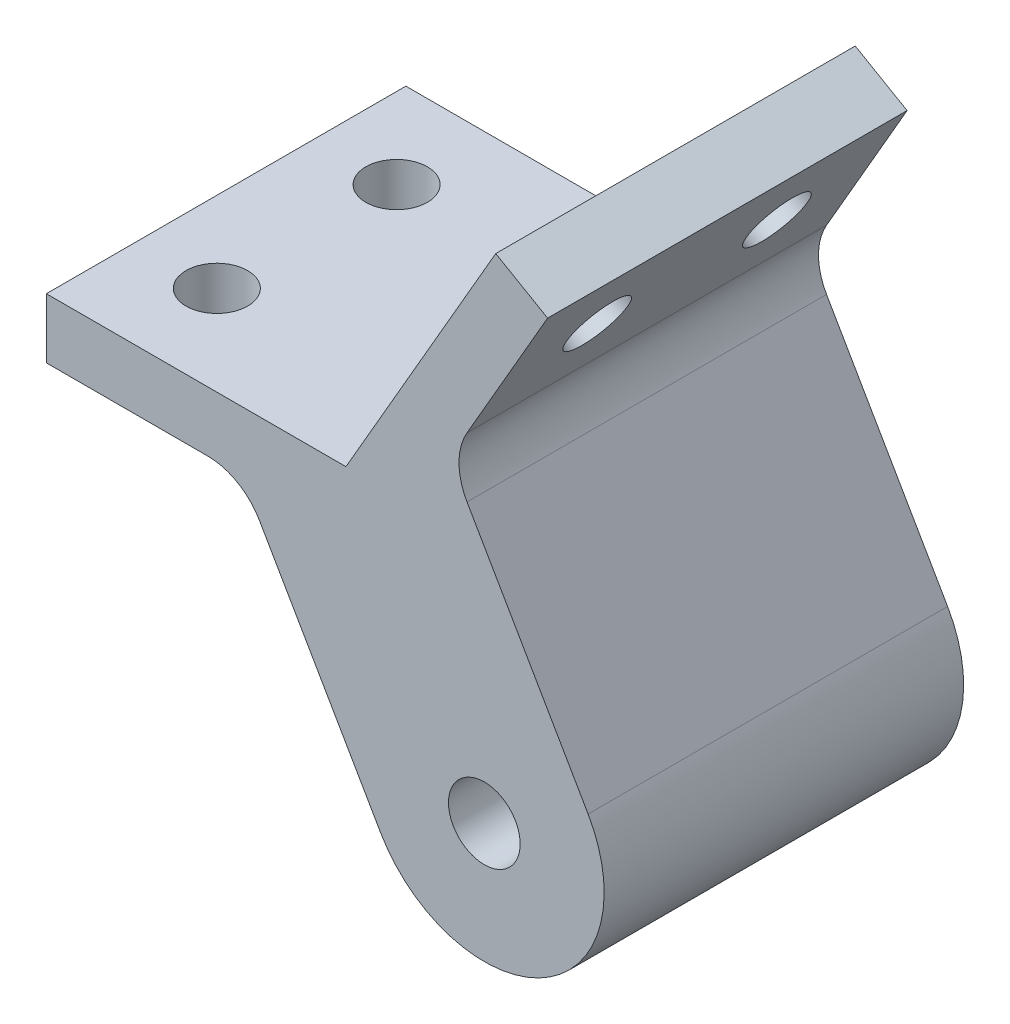
ISO-10303-21;
HEADER;
FILE_DESCRIPTION(('STEP AP214'),'2;1');
FILE_NAME('part.step','',(''),(''),'','','');
FILE_SCHEMA(('AUTOMOTIVE_DESIGN { 1 0 10303 214 1 1 1 1 }'));
ENDSEC;
DATA;
#1=APPLICATION_CONTEXT('core data for automotive mechanical design processes');
#2=APPLICATION_PROTOCOL_DEFINITION('international standard','automotive_design',2000,#1);
#3=PRODUCT_CONTEXT('',#1,'mechanical');
#4=PRODUCT('Part','Part','',(#3));
#5=PRODUCT_RELATED_PRODUCT_CATEGORY('part','',(#4));
#6=PRODUCT_DEFINITION_FORMATION('','',#4);
#7=PRODUCT_DEFINITION_CONTEXT('part definition',#1,'design');
#8=PRODUCT_DEFINITION('design','',#6,#7);
#9=PRODUCT_DEFINITION_SHAPE('','',#8);
#10=(LENGTH_UNIT() NAMED_UNIT(*) SI_UNIT(.MILLI.,.METRE.));
#11=(NAMED_UNIT(*) PLANE_ANGLE_UNIT() SI_UNIT($,.RADIAN.));
#12=(NAMED_UNIT(*) SI_UNIT($,.STERADIAN.) SOLID_ANGLE_UNIT());
#13=UNCERTAINTY_MEASURE_WITH_UNIT(LENGTH_MEASURE(1.E-05),#10,'distance_accuracy_value','');
#14=(GEOMETRIC_REPRESENTATION_CONTEXT(3) GLOBAL_UNCERTAINTY_ASSIGNED_CONTEXT((#13)) GLOBAL_UNIT_ASSIGNED_CONTEXT((#10,
#11,#12)) REPRESENTATION_CONTEXT('',''));
#15=CARTESIAN_POINT('',(0.,0.,0.));
#16=DIRECTION('',(0.,0.,1.));
#17=DIRECTION('',(1.,0.,0.));
#18=AXIS2_PLACEMENT_3D('',#15,#16,#17);
#19=CARTESIAN_POINT('',(-7.33234841870827,12.7,19.05));
#20=DIRECTION('',(0.,-1.,0.));
#21=DIRECTION('',(1.,0.,0.));
#22=AXIS2_PLACEMENT_3D('',#19,#20,#21);
#23=PLANE('',#22);
#24=CARTESIAN_POINT('',(-18.9360226280624,12.7,4.7625));
#25=DIRECTION('',(0.,-1.,0.));
#26=DIRECTION('',(1.,0.,0.));
#27=AXIS2_PLACEMENT_3D('',#24,#25,#26);
#28=CIRCLE('',#27,1.63194999999999);
#29=CARTESIAN_POINT('',(-17.3040726280624,12.7,4.7625));
#30=VERTEX_POINT('',#29);
#31=EDGE_CURVE('E257',#30,#30,#28,.T.);
#32=ORIENTED_EDGE('',*,*,#31,.T.);
#33=EDGE_LOOP('',(#32));
#34=FACE_BOUND('',#33,.T.);
#35=CARTESIAN_POINT('',(-18.9360226280624,12.7,14.2875));
#36=DIRECTION('',(0.,-1.,0.));
#37=DIRECTION('',(1.,0.,0.));
#38=AXIS2_PLACEMENT_3D('',#35,#36,#37);
#39=CIRCLE('',#38,1.63194999999999);
#40=CARTESIAN_POINT('',(-17.3040726280624,12.7,14.2875));
#41=VERTEX_POINT('',#40);
#42=EDGE_CURVE('E251',#41,#41,#39,.T.);
#43=ORIENTED_EDGE('',*,*,#42,.T.);
#44=EDGE_LOOP('',(#43));
#45=FACE_BOUND('',#44,.T.);
#46=DIRECTION('',(-1.,0.,0.));
#47=VECTOR('',#46,1.);
#48=CARTESIAN_POINT('',(-7.33234841870827,12.7,0.));
#49=LINE('',#48,#47);
#50=CARTESIAN_POINT('',(-7.33234841870827,12.7,0.));
#51=VERTEX_POINT('',#50);
#52=CARTESIAN_POINT('',(-23.2073484187083,12.7,0.));
#53=VERTEX_POINT('',#52);
#54=EDGE_CURVE('E145',#51,#53,#49,.T.);
#55=ORIENTED_EDGE('',*,*,#54,.T.);
#56=DIRECTION('',(0.,0.,-1.));
#57=VECTOR('',#56,1.);
#58=CARTESIAN_POINT('',(-23.2073484187083,12.7,19.05));
#59=LINE('',#58,#57);
#60=CARTESIAN_POINT('',(-23.2073484187083,12.7,19.05));
#61=VERTEX_POINT('',#60);
#62=EDGE_CURVE('E125',#61,#53,#59,.T.);
#63=ORIENTED_EDGE('',*,*,#62,.F.);
#64=DIRECTION('',(-1.,0.,0.));
#65=VECTOR('',#64,1.);
#66=CARTESIAN_POINT('',(-7.33234841870827,12.7,19.05));
#67=LINE('',#66,#65);
#68=CARTESIAN_POINT('',(-7.33234841870827,12.7,19.05));
#69=VERTEX_POINT('',#68);
#70=EDGE_CURVE('E133',#69,#61,#67,.T.);
#71=ORIENTED_EDGE('',*,*,#70,.F.);
#72=DIRECTION('',(0.,0.,-1.));
#73=VECTOR('',#72,1.);
#74=CARTESIAN_POINT('',(-7.33234841870827,12.7,19.05));
#75=LINE('',#74,#73);
#76=EDGE_CURVE('E202',#69,#51,#75,.T.);
#77=ORIENTED_EDGE('',*,*,#76,.T.);
#78=EDGE_LOOP('',(#55,#63,#71,#77));
#79=FACE_BOUND('',#78,.T.);
#80=ADVANCED_FACE('F37',(#34,#45,#79),#23,.F.);
#81=CARTESIAN_POINT('',(-23.2073484187083,12.7,19.05));
#82=DIRECTION('',(1.,0.,0.));
#83=DIRECTION('',(0.,0.,-1.));
#84=AXIS2_PLACEMENT_3D('',#81,#82,#83);
#85=PLANE('',#84);
#86=DIRECTION('',(0.,-1.,0.));
#87=VECTOR('',#86,1.);
#88=CARTESIAN_POINT('',(-23.2073484187083,12.7,0.));
#89=LINE('',#88,#87);
#90=CARTESIAN_POINT('',(-23.2073484187083,9.525,0.));
#91=VERTEX_POINT('',#90);
#92=EDGE_CURVE('E187',#53,#91,#89,.T.);
#93=ORIENTED_EDGE('',*,*,#92,.T.);
#94=DIRECTION('',(0.,0.,-1.));
#95=VECTOR('',#94,1.);
#96=CARTESIAN_POINT('',(-23.2073484187083,9.525,19.05));
#97=LINE('',#96,#95);
#98=CARTESIAN_POINT('',(-23.2073484187083,9.525,19.05));
#99=VERTEX_POINT('',#98);
#100=EDGE_CURVE('E128',#99,#91,#97,.T.);
#101=ORIENTED_EDGE('',*,*,#100,.F.);
#102=DIRECTION('',(0.,-1.,0.));
#103=VECTOR('',#102,1.);
#104=CARTESIAN_POINT('',(-23.2073484187083,12.7,19.05));
#105=LINE('',#104,#103);
#106=EDGE_CURVE('E121',#61,#99,#105,.T.);
#107=ORIENTED_EDGE('',*,*,#106,.F.);
#108=ORIENTED_EDGE('',*,*,#62,.T.);
#109=EDGE_LOOP('',(#93,#101,#107,#108));
#110=FACE_BOUND('',#109,.T.);
#111=ADVANCED_FACE('F123',(#110),#85,.F.);
#112=CARTESIAN_POINT('',(-23.2073484187083,9.525,19.05));
#113=DIRECTION('',(0.,1.,0.));
#114=DIRECTION('',(-1.,0.,0.));
#115=AXIS2_PLACEMENT_3D('',#112,#113,#114);
#116=PLANE('',#115);
#117=CARTESIAN_POINT('',(-18.9360226280624,9.52499999999999,4.7625));
#118=DIRECTION('',(0.,-1.,0.));
#119=DIRECTION('',(0.,0.,-1.));
#120=AXIS2_PLACEMENT_3D('',#117,#118,#119);
#121=CIRCLE('',#120,1.63194999999999);
#122=CARTESIAN_POINT('',(-18.9360226280624,9.52499999999999,3.13055000000001));
#123=VERTEX_POINT('',#122);
#124=EDGE_CURVE('E260',#123,#123,#121,.T.);
#125=ORIENTED_EDGE('',*,*,#124,.F.);
#126=EDGE_LOOP('',(#125));
#127=FACE_BOUND('',#126,.T.);
#128=CARTESIAN_POINT('',(-18.9360226280624,9.52499999999999,14.2875));
#129=DIRECTION('',(0.,-1.,0.));
#130=DIRECTION('',(0.,0.,-1.));
#131=AXIS2_PLACEMENT_3D('',#128,#129,#130);
#132=CIRCLE('',#131,1.63194999999999);
#133=CARTESIAN_POINT('',(-18.9360226280624,9.52499999999999,12.65555));
#134=VERTEX_POINT('',#133);
#135=EDGE_CURVE('E254',#134,#134,#132,.T.);
#136=ORIENTED_EDGE('',*,*,#135,.F.);
#137=EDGE_LOOP('',(#136));
#138=FACE_BOUND('',#137,.T.);
#139=DIRECTION('',(1.,0.,0.));
#140=VECTOR('',#139,1.);
#141=CARTESIAN_POINT('',(-23.2073484187083,9.525,0.));
#142=LINE('',#141,#140);
#143=CARTESIAN_POINT('',(-14.6646968374165,9.525,0.));
#144=VERTEX_POINT('',#143);
#145=EDGE_CURVE('E182',#91,#144,#142,.T.);
#146=ORIENTED_EDGE('',*,*,#145,.T.);
#147=DIRECTION('',(0.,0.,-1.));
#148=VECTOR('',#147,1.);
#149=CARTESIAN_POINT('',(-14.6646968374165,9.525,19.05));
#150=LINE('',#149,#148);
#151=CARTESIAN_POINT('',(-14.6646968374165,9.525,19.05));
#152=VERTEX_POINT('',#151);
#153=EDGE_CURVE('E149',#144,#152,#150,.F.);
#154=ORIENTED_EDGE('',*,*,#153,.T.);
#155=DIRECTION('',(1.,0.,0.));
#156=VECTOR('',#155,1.);
#157=CARTESIAN_POINT('',(-23.2073484187083,9.525,19.05));
#158=LINE('',#157,#156);
#159=EDGE_CURVE('E132',#99,#152,#158,.T.);
#160=ORIENTED_EDGE('',*,*,#159,.F.);
#161=ORIENTED_EDGE('',*,*,#100,.T.);
#162=EDGE_LOOP('',(#146,#154,#160,#161));
#163=FACE_BOUND('',#162,.T.);
#164=ADVANCED_FACE('F186',(#127,#138,#163),#116,.F.);
#165=CARTESIAN_POINT('',(-5.49926131403118,-3.17500000000001,19.05));
#166=DIRECTION('',(0.866025403784438,0.500000000000001,0.));
#167=DIRECTION('',(-0.500000000000002,0.866025403784438,0.));
#168=AXIS2_PLACEMENT_3D('',#165,#166,#167);
#169=PLANE('',#168);
#170=DIRECTION('',(0.500000000000001,-0.866025403784438,0.));
#171=VECTOR('',#170,1.);
#172=CARTESIAN_POINT('',(-5.49926131403118,-3.17500000000001,19.05));
#173=LINE('',#172,#171);
#174=CARTESIAN_POINT('',(-11.9150661804009,7.9375,19.05));
#175=VERTEX_POINT('',#174);
#176=CARTESIAN_POINT('',(-5.49926131403118,-3.17500000000001,19.05));
#177=VERTEX_POINT('',#176);
#178=EDGE_CURVE('E166',#175,#177,#173,.T.);
#179=ORIENTED_EDGE('',*,*,#178,.F.);
#180=DIRECTION('',(0.,0.,-1.));
#181=VECTOR('',#180,1.);
#182=CARTESIAN_POINT('',(-11.9150661804009,7.9375,0.));
#183=LINE('',#182,#181);
#184=CARTESIAN_POINT('',(-11.9150661804009,7.9375,0.));
#185=VERTEX_POINT('',#184);
#186=EDGE_CURVE('E146',#175,#185,#183,.T.);
#187=ORIENTED_EDGE('',*,*,#186,.T.);
#188=DIRECTION('',(0.500000000000001,-0.866025403784438,0.));
#189=VECTOR('',#188,1.);
#190=CARTESIAN_POINT('',(-5.49926131403118,-3.17500000000001,0.));
#191=LINE('',#190,#189);
#192=CARTESIAN_POINT('',(-5.49926131403118,-3.17500000000001,0.));
#193=VERTEX_POINT('',#192);
#194=EDGE_CURVE('E184',#185,#193,#191,.T.);
#195=ORIENTED_EDGE('',*,*,#194,.T.);
#196=DIRECTION('',(0.,0.,-1.));
#197=VECTOR('',#196,1.);
#198=CARTESIAN_POINT('',(-5.49926131403118,-3.17500000000001,19.05));
#199=LINE('',#198,#197);
#200=EDGE_CURVE('E151',#177,#193,#199,.T.);
#201=ORIENTED_EDGE('',*,*,#200,.F.);
#202=EDGE_LOOP('',(#179,#187,#195,#201));
#203=FACE_BOUND('',#202,.T.);
#204=ADVANCED_FACE('F172',(#203),#169,.F.);
#205=CARTESIAN_POINT('',(0.,0.,19.05));
#206=DIRECTION('',(0.,0.,-1.));
#207=DIRECTION('',(-1.,0.,0.));
#208=AXIS2_PLACEMENT_3D('',#205,#206,#207);
#209=CYLINDRICAL_SURFACE('',#208,6.35);
#210=CARTESIAN_POINT('',(0.,0.,0.));
#211=DIRECTION('',(0.,0.,1.));
#212=DIRECTION('',(1.,0.,0.));
#213=AXIS2_PLACEMENT_3D('',#210,#211,#212);
#214=CIRCLE('',#213,6.35);
#215=CARTESIAN_POINT('',(5.49926131403118,3.17500000000001,0.));
#216=VERTEX_POINT('',#215);
#217=EDGE_CURVE('E189',#193,#216,#214,.T.);
#218=ORIENTED_EDGE('',*,*,#217,.T.);
#219=DIRECTION('',(0.,0.,-1.));
#220=VECTOR('',#219,1.);
#221=CARTESIAN_POINT('',(5.49926131403118,3.17500000000001,19.05));
#222=LINE('',#221,#220);
#223=CARTESIAN_POINT('',(5.49926131403118,3.17500000000001,19.05));
#224=VERTEX_POINT('',#223);
#225=EDGE_CURVE('E210',#224,#216,#222,.T.);
#226=ORIENTED_EDGE('',*,*,#225,.F.);
#227=CARTESIAN_POINT('',(0.,0.,19.05));
#228=DIRECTION('',(0.,0.,1.));
#229=DIRECTION('',(1.,0.,0.));
#230=AXIS2_PLACEMENT_3D('',#227,#228,#229);
#231=CIRCLE('',#230,6.35);
#232=EDGE_CURVE('E176',#177,#224,#231,.T.);
#233=ORIENTED_EDGE('',*,*,#232,.F.);
#234=ORIENTED_EDGE('',*,*,#200,.T.);
#235=EDGE_LOOP('',(#218,#226,#233,#234));
#236=FACE_BOUND('',#235,.T.);
#237=ADVANCED_FACE('F213',(#236),#209,.T.);
#238=CARTESIAN_POINT('',(5.49926131403118,3.17500000000001,19.05));
#239=DIRECTION('',(-0.866025403784438,-0.500000000000002,0.));
#240=DIRECTION('',(0.500000000000002,-0.866025403784438,0.));
#241=AXIS2_PLACEMENT_3D('',#238,#239,#240);
#242=PLANE('',#241);
#243=DIRECTION('',(-0.500000000000002,0.866025403784438,0.));
#244=VECTOR('',#243,1.);
#245=CARTESIAN_POINT('',(5.49926131403118,3.17500000000001,0.));
#246=LINE('',#245,#244);
#247=CARTESIAN_POINT('',(-0.916543552338565,14.2875,0.));
#248=VERTEX_POINT('',#247);
#249=EDGE_CURVE('E195',#216,#248,#246,.T.);
#250=ORIENTED_EDGE('',*,*,#249,.T.);
#251=DIRECTION('',(0.,0.,-1.));
#252=VECTOR('',#251,1.);
#253=CARTESIAN_POINT('',(-0.916543552338564,14.2875,19.05));
#254=LINE('',#253,#252);
#255=CARTESIAN_POINT('',(-0.916543552338565,14.2875,19.05));
#256=VERTEX_POINT('',#255);
#257=EDGE_CURVE('E53',#248,#256,#254,.F.);
#258=ORIENTED_EDGE('',*,*,#257,.T.);
#259=DIRECTION('',(-0.500000000000002,0.866025403784438,0.));
#260=VECTOR('',#259,1.);
#261=CARTESIAN_POINT('',(5.49926131403118,3.17500000000001,19.05));
#262=LINE('',#261,#260);
#263=EDGE_CURVE('E222',#224,#256,#262,.T.);
#264=ORIENTED_EDGE('',*,*,#263,.F.);
#265=ORIENTED_EDGE('',*,*,#225,.T.);
#266=EDGE_LOOP('',(#250,#258,#264,#265));
#267=FACE_BOUND('',#266,.T.);
#268=ADVANCED_FACE('F215',(#267),#242,.F.);
#269=CARTESIAN_POINT('',(3.35478223830729,24.860653285078,19.05));
#270=DIRECTION('',(-0.86602540378444,0.499999999999998,0.));
#271=DIRECTION('',(-0.499999999999998,-0.86602540378444,0.));
#272=AXIS2_PLACEMENT_3D('',#269,#270,#271);
#273=PLANE('',#272);
#274=CARTESIAN_POINT('',(1.21911934298436,21.161576642539,14.2875));
#275=DIRECTION('',(0.86602540378444,-0.499999999999998,0.));
#276=DIRECTION('',(0.499999999999998,0.86602540378444,0.));
#277=AXIS2_PLACEMENT_3D('',#274,#275,#276);
#278=CIRCLE('',#277,1.63194999999999);
#279=CARTESIAN_POINT('',(2.03509434298435,22.574886800245,14.2875));
#280=VERTEX_POINT('',#279);
#281=EDGE_CURVE('E248',#280,#280,#278,.T.);
#282=ORIENTED_EDGE('',*,*,#281,.F.);
#283=EDGE_LOOP('',(#282));
#284=FACE_BOUND('',#283,.T.);
#285=CARTESIAN_POINT('',(1.21911934298436,21.161576642539,4.7625));
#286=DIRECTION('',(0.86602540378444,-0.499999999999998,0.));
#287=DIRECTION('',(0.499999999999998,0.86602540378444,0.));
#288=AXIS2_PLACEMENT_3D('',#285,#286,#287);
#289=CIRCLE('',#288,1.63194999999999);
#290=CARTESIAN_POINT('',(2.03509434298435,22.574886800245,4.7625));
#291=VERTEX_POINT('',#290);
#292=EDGE_CURVE('E245',#291,#291,#289,.T.);
#293=ORIENTED_EDGE('',*,*,#292,.F.);
#294=EDGE_LOOP('',(#293));
#295=FACE_BOUND('',#294,.T.);
#296=DIRECTION('',(0.499999999999998,0.86602540378444,0.));
#297=VECTOR('',#296,1.);
#298=CARTESIAN_POINT('',(3.35478223830729,24.860653285078,19.05));
#299=LINE('',#298,#297);
#300=CARTESIAN_POINT('',(-0.916543552338572,17.4625,19.05));
#301=VERTEX_POINT('',#300);
#302=CARTESIAN_POINT('',(3.35478223830729,24.860653285078,19.05));
#303=VERTEX_POINT('',#302);
#304=EDGE_CURVE('E220',#301,#303,#299,.T.);
#305=ORIENTED_EDGE('',*,*,#304,.F.);
#306=DIRECTION('',(0.,0.,-1.));
#307=VECTOR('',#306,1.);
#308=CARTESIAN_POINT('',(-0.916543552338573,17.4625,0.));
#309=LINE('',#308,#307);
#310=CARTESIAN_POINT('',(-0.916543552338572,17.4625,0.));
#311=VERTEX_POINT('',#310);
#312=EDGE_CURVE('E156',#301,#311,#309,.T.);
#313=ORIENTED_EDGE('',*,*,#312,.T.);
#314=DIRECTION('',(0.499999999999998,0.86602540378444,0.));
#315=VECTOR('',#314,1.);
#316=CARTESIAN_POINT('',(3.35478223830729,24.860653285078,0.));
#317=LINE('',#316,#315);
#318=CARTESIAN_POINT('',(3.35478223830729,24.860653285078,0.));
#319=VERTEX_POINT('',#318);
#320=EDGE_CURVE('E197',#311,#319,#317,.T.);
#321=ORIENTED_EDGE('',*,*,#320,.T.);
#322=DIRECTION('',(0.,0.,-1.));
#323=VECTOR('',#322,1.);
#324=CARTESIAN_POINT('',(3.35478223830729,24.860653285078,19.05));
#325=LINE('',#324,#323);
#326=EDGE_CURVE('E207',#303,#319,#325,.T.);
#327=ORIENTED_EDGE('',*,*,#326,.F.);
#328=EDGE_LOOP('',(#305,#313,#321,#327));
#329=FACE_BOUND('',#328,.T.);
#330=ADVANCED_FACE('F224',(#284,#295,#329),#273,.F.);
#331=CARTESIAN_POINT('',(0.605151581291688,26.448153285078,19.05));
#332=DIRECTION('',(-0.499999999999997,-0.86602540378444,0.));
#333=DIRECTION('',(0.86602540378444,-0.499999999999997,0.));
#334=AXIS2_PLACEMENT_3D('',#331,#332,#333);
#335=PLANE('',#334);
#336=DIRECTION('',(-0.86602540378444,0.499999999999997,0.));
#337=VECTOR('',#336,1.);
#338=CARTESIAN_POINT('',(0.605151581291688,26.448153285078,0.));
#339=LINE('',#338,#337);
#340=CARTESIAN_POINT('',(0.605151581291688,26.448153285078,0.));
#341=VERTEX_POINT('',#340);
#342=EDGE_CURVE('E199',#319,#341,#339,.T.);
#343=ORIENTED_EDGE('',*,*,#342,.T.);
#344=DIRECTION('',(0.,0.,-1.));
#345=VECTOR('',#344,1.);
#346=CARTESIAN_POINT('',(0.605151581291688,26.448153285078,19.05));
#347=LINE('',#346,#345);
#348=CARTESIAN_POINT('',(0.605151581291688,26.448153285078,19.05));
#349=VERTEX_POINT('',#348);
#350=EDGE_CURVE('E204',#349,#341,#347,.T.);
#351=ORIENTED_EDGE('',*,*,#350,.F.);
#352=DIRECTION('',(-0.86602540378444,0.499999999999997,0.));
#353=VECTOR('',#352,1.);
#354=CARTESIAN_POINT('',(0.605151581291688,26.448153285078,19.05));
#355=LINE('',#354,#353);
#356=EDGE_CURVE('E226',#303,#349,#355,.T.);
#357=ORIENTED_EDGE('',*,*,#356,.F.);
#358=ORIENTED_EDGE('',*,*,#326,.T.);
#359=EDGE_LOOP('',(#343,#351,#357,#358));
#360=FACE_BOUND('',#359,.T.);
#361=ADVANCED_FACE('F309',(#360),#335,.F.);
#362=CARTESIAN_POINT('',(-7.33234841870827,12.7,19.05));
#363=DIRECTION('',(0.86602540378444,-0.499999999999998,0.));
#364=DIRECTION('',(0.499999999999998,0.86602540378444,0.));
#365=AXIS2_PLACEMENT_3D('',#362,#363,#364);
#366=PLANE('',#365);
#367=CARTESIAN_POINT('',(-1.53051131403124,22.749076642539,14.2875));
#368=DIRECTION('',(0.86602540378444,-0.499999999999998,0.));
#369=DIRECTION('',(0.499999999999998,0.86602540378444,0.));
#370=AXIS2_PLACEMENT_3D('',#367,#368,#369);
#371=CIRCLE('',#370,1.63194999999999);
#372=CARTESIAN_POINT('',(-0.714536314031247,24.162386800245,14.2875));
#373=VERTEX_POINT('',#372);
#374=EDGE_CURVE('E41',#373,#373,#371,.T.);
#375=ORIENTED_EDGE('',*,*,#374,.T.);
#376=EDGE_LOOP('',(#375));
#377=FACE_BOUND('',#376,.T.);
#378=CARTESIAN_POINT('',(-1.53051131403124,22.749076642539,4.7625));
#379=DIRECTION('',(0.86602540378444,-0.499999999999998,0.));
#380=DIRECTION('',(0.499999999999998,0.86602540378444,0.));
#381=AXIS2_PLACEMENT_3D('',#378,#379,#380);
#382=CIRCLE('',#381,1.63194999999999);
#383=CARTESIAN_POINT('',(-0.714536314031247,24.162386800245,4.7625));
#384=VERTEX_POINT('',#383);
#385=EDGE_CURVE('E239',#384,#384,#382,.T.);
#386=ORIENTED_EDGE('',*,*,#385,.T.);
#387=EDGE_LOOP('',(#386));
#388=FACE_BOUND('',#387,.T.);
#389=DIRECTION('',(-0.499999999999998,-0.86602540378444,0.));
#390=VECTOR('',#389,1.);
#391=CARTESIAN_POINT('',(-7.33234841870827,12.7,0.));
#392=LINE('',#391,#390);
#393=EDGE_CURVE('E142',#341,#51,#392,.T.);
#394=ORIENTED_EDGE('',*,*,#393,.T.);
#395=ORIENTED_EDGE('',*,*,#76,.F.);
#396=DIRECTION('',(-0.499999999999998,-0.86602540378444,0.));
#397=VECTOR('',#396,1.);
#398=CARTESIAN_POINT('',(-7.33234841870827,12.7,19.05));
#399=LINE('',#398,#397);
#400=EDGE_CURVE('E138',#349,#69,#399,.T.);
#401=ORIENTED_EDGE('',*,*,#400,.F.);
#402=ORIENTED_EDGE('',*,*,#350,.T.);
#403=EDGE_LOOP('',(#394,#395,#401,#402));
#404=FACE_BOUND('',#403,.T.);
#405=ADVANCED_FACE('F305',(#377,#388,#404),#366,.F.);
#406=CARTESIAN_POINT('',(0.,0.,19.05));
#407=DIRECTION('',(0.,0.,1.));
#408=DIRECTION('',(1.,0.,0.));
#409=AXIS2_PLACEMENT_3D('',#406,#407,#408);
#410=PLANE('',#409);
#411=CARTESIAN_POINT('',(0.,0.,19.05));
#412=DIRECTION('',(0.,0.,-1.));
#413=DIRECTION('',(-1.,0.,0.));
#414=AXIS2_PLACEMENT_3D('',#411,#412,#413);
#415=CIRCLE('',#414,1.89865);
#416=CARTESIAN_POINT('',(-1.89865,0.,19.05));
#417=VERTEX_POINT('',#416);
#418=EDGE_CURVE('E232',#417,#417,#415,.T.);
#419=ORIENTED_EDGE('',*,*,#418,.T.);
#420=EDGE_LOOP('',(#419));
#421=FACE_BOUND('',#420,.T.);
#422=ORIENTED_EDGE('',*,*,#70,.T.);
#423=ORIENTED_EDGE('',*,*,#106,.T.);
#424=ORIENTED_EDGE('',*,*,#159,.T.);
#425=CARTESIAN_POINT('',(-14.6646968374165,6.35,19.05));
#426=DIRECTION('',(0.,0.,1.));
#427=DIRECTION('',(1.,0.,0.));
#428=AXIS2_PLACEMENT_3D('',#425,#426,#427);
#429=CIRCLE('',#428,3.175);
#430=EDGE_CURVE('E162',#152,#175,#429,.F.);
#431=ORIENTED_EDGE('',*,*,#430,.T.);
#432=ORIENTED_EDGE('',*,*,#178,.T.);
#433=ORIENTED_EDGE('',*,*,#232,.T.);
#434=ORIENTED_EDGE('',*,*,#263,.T.);
#435=CARTESIAN_POINT('',(1.83308710467702,15.875,19.05));
#436=DIRECTION('',(0.,0.,1.));
#437=DIRECTION('',(1.,0.,0.));
#438=AXIS2_PLACEMENT_3D('',#435,#436,#437);
#439=CIRCLE('',#438,3.175);
#440=EDGE_CURVE('E11',#256,#301,#439,.F.);
#441=ORIENTED_EDGE('',*,*,#440,.T.);
#442=ORIENTED_EDGE('',*,*,#304,.T.);
#443=ORIENTED_EDGE('',*,*,#356,.T.);
#444=ORIENTED_EDGE('',*,*,#400,.T.);
#445=EDGE_LOOP('',(#422,#423,#424,#431,#432,#433,#434,#441,#442,#443,#444));
#446=FACE_BOUND('',#445,.T.);
#447=ADVANCED_FACE('F136',(#421,#446),#410,.T.);
#448=CARTESIAN_POINT('',(0.,0.,0.));
#449=DIRECTION('',(0.,0.,1.));
#450=DIRECTION('',(1.,0.,0.));
#451=AXIS2_PLACEMENT_3D('',#448,#449,#450);
#452=PLANE('',#451);
#453=CARTESIAN_POINT('',(0.,0.,0.));
#454=DIRECTION('',(0.,0.,-1.));
#455=DIRECTION('',(-1.,0.,0.));
#456=AXIS2_PLACEMENT_3D('',#453,#454,#455);
#457=CIRCLE('',#456,1.89865);
#458=CARTESIAN_POINT('',(-1.89865,0.,0.));
#459=VERTEX_POINT('',#458);
#460=EDGE_CURVE('E234',#459,#459,#457,.T.);
#461=ORIENTED_EDGE('',*,*,#460,.F.);
#462=EDGE_LOOP('',(#461));
#463=FACE_BOUND('',#462,.T.);
#464=ORIENTED_EDGE('',*,*,#54,.F.);
#465=ORIENTED_EDGE('',*,*,#393,.F.);
#466=ORIENTED_EDGE('',*,*,#342,.F.);
#467=ORIENTED_EDGE('',*,*,#320,.F.);
#468=CARTESIAN_POINT('',(1.83308710467702,15.875,0.));
#469=DIRECTION('',(0.,0.,1.));
#470=DIRECTION('',(1.,0.,0.));
#471=AXIS2_PLACEMENT_3D('',#468,#469,#470);
#472=CIRCLE('',#471,3.175);
#473=EDGE_CURVE('E46',#311,#248,#472,.T.);
#474=ORIENTED_EDGE('',*,*,#473,.T.);
#475=ORIENTED_EDGE('',*,*,#249,.F.);
#476=ORIENTED_EDGE('',*,*,#217,.F.);
#477=ORIENTED_EDGE('',*,*,#194,.F.);
#478=CARTESIAN_POINT('',(-14.6646968374165,6.35,0.));
#479=DIRECTION('',(0.,0.,1.));
#480=DIRECTION('',(1.,0.,0.));
#481=AXIS2_PLACEMENT_3D('',#478,#479,#480);
#482=CIRCLE('',#481,3.175);
#483=EDGE_CURVE('E160',#185,#144,#482,.T.);
#484=ORIENTED_EDGE('',*,*,#483,.T.);
#485=ORIENTED_EDGE('',*,*,#145,.F.);
#486=ORIENTED_EDGE('',*,*,#92,.F.);
#487=EDGE_LOOP('',(#464,#465,#466,#467,#474,#475,#476,#477,#484,#485,#486));
#488=FACE_BOUND('',#487,.T.);
#489=ADVANCED_FACE('F181',(#463,#488),#452,.F.);
#490=CARTESIAN_POINT('',(0.,0.,0.));
#491=DIRECTION('',(0.,0.,-1.));
#492=DIRECTION('',(-1.,0.,0.));
#493=AXIS2_PLACEMENT_3D('',#490,#491,#492);
#494=CYLINDRICAL_SURFACE('',#493,1.89865);
#495=ORIENTED_EDGE('',*,*,#418,.F.);
#496=EDGE_LOOP('',(#495));
#497=FACE_BOUND('',#496,.T.);
#498=ORIENTED_EDGE('',*,*,#460,.T.);
#499=EDGE_LOOP('',(#498));
#500=FACE_BOUND('',#499,.T.);
#501=ADVANCED_FACE('F287',(#497,#500),#494,.F.);
#502=CARTESIAN_POINT('',(-14.6646968374165,6.35,19.05));
#503=DIRECTION('',(0.,0.,1.));
#504=DIRECTION('',(1.,0.,0.));
#505=AXIS2_PLACEMENT_3D('',#502,#503,#504);
#506=CYLINDRICAL_SURFACE('',#505,3.175);
#507=ORIENTED_EDGE('',*,*,#430,.F.);
#508=ORIENTED_EDGE('',*,*,#153,.F.);
#509=ORIENTED_EDGE('',*,*,#483,.F.);
#510=ORIENTED_EDGE('',*,*,#186,.F.);
#511=EDGE_LOOP('',(#507,#508,#509,#510));
#512=FACE_BOUND('',#511,.T.);
#513=ADVANCED_FACE('F178',(#512),#506,.F.);
#514=CARTESIAN_POINT('',(1.83308710467702,15.875,19.05));
#515=DIRECTION('',(0.,0.,1.));
#516=DIRECTION('',(1.,0.,0.));
#517=AXIS2_PLACEMENT_3D('',#514,#515,#516);
#518=CYLINDRICAL_SURFACE('',#517,3.175);
#519=ORIENTED_EDGE('',*,*,#440,.F.);
#520=ORIENTED_EDGE('',*,*,#257,.F.);
#521=ORIENTED_EDGE('',*,*,#473,.F.);
#522=ORIENTED_EDGE('',*,*,#312,.F.);
#523=EDGE_LOOP('',(#519,#520,#521,#522));
#524=FACE_BOUND('',#523,.T.);
#525=ADVANCED_FACE('F39',(#524),#518,.F.);
#526=CARTESIAN_POINT('',(1.21911934298436,21.161576642539,4.7625));
#527=DIRECTION('',(0.86602540378444,-0.499999999999998,0.));
#528=DIRECTION('',(0.499999999999998,0.86602540378444,0.));
#529=AXIS2_PLACEMENT_3D('',#526,#527,#528);
#530=CYLINDRICAL_SURFACE('',#529,1.63194999999999);
#531=ORIENTED_EDGE('',*,*,#292,.T.);
#532=EDGE_LOOP('',(#531));
#533=FACE_BOUND('',#532,.T.);
#534=ORIENTED_EDGE('',*,*,#385,.F.);
#535=EDGE_LOOP('',(#534));
#536=FACE_BOUND('',#535,.T.);
#537=ADVANCED_FACE('F292',(#533,#536),#530,.F.);
#538=CARTESIAN_POINT('',(1.21911934298436,21.161576642539,14.2875));
#539=DIRECTION('',(0.86602540378444,-0.499999999999998,0.));
#540=DIRECTION('',(0.499999999999998,0.86602540378444,0.));
#541=AXIS2_PLACEMENT_3D('',#538,#539,#540);
#542=CYLINDRICAL_SURFACE('',#541,1.63194999999999);
#543=ORIENTED_EDGE('',*,*,#281,.T.);
#544=EDGE_LOOP('',(#543));
#545=FACE_BOUND('',#544,.T.);
#546=ORIENTED_EDGE('',*,*,#374,.F.);
#547=EDGE_LOOP('',(#546));
#548=FACE_BOUND('',#547,.T.);
#549=ADVANCED_FACE('F275',(#545,#548),#542,.F.);
#550=CARTESIAN_POINT('',(-18.9360226280624,9.525,14.2875));
#551=DIRECTION('',(0.,-1.,0.));
#552=DIRECTION('',(0.,0.,-1.));
#553=AXIS2_PLACEMENT_3D('',#550,#551,#552);
#554=CYLINDRICAL_SURFACE('',#553,1.63194999999999);
#555=ORIENTED_EDGE('',*,*,#135,.T.);
#556=EDGE_LOOP('',(#555));
#557=FACE_BOUND('',#556,.T.);
#558=ORIENTED_EDGE('',*,*,#42,.F.);
#559=EDGE_LOOP('',(#558));
#560=FACE_BOUND('',#559,.T.);
#561=ADVANCED_FACE('F272',(#557,#560),#554,.F.);
#562=CARTESIAN_POINT('',(-18.9360226280624,9.525,4.7625));
#563=DIRECTION('',(0.,-1.,0.));
#564=DIRECTION('',(0.,0.,-1.));
#565=AXIS2_PLACEMENT_3D('',#562,#563,#564);
#566=CYLINDRICAL_SURFACE('',#565,1.63194999999999);
#567=ORIENTED_EDGE('',*,*,#124,.T.);
#568=EDGE_LOOP('',(#567));
#569=FACE_BOUND('',#568,.T.);
#570=ORIENTED_EDGE('',*,*,#31,.F.);
#571=EDGE_LOOP('',(#570));
#572=FACE_BOUND('',#571,.T.);
#573=ADVANCED_FACE('F264',(#569,#572),#566,.F.);
#574=CLOSED_SHELL('',(#80,#111,#164,#204,#237,#268,#330,#361,#405,#447,#489,#501,#513,#525,#537,
#549,#561,#573));
#575=MANIFOLD_SOLID_BREP('B2',#574);
#576=ADVANCED_BREP_SHAPE_REPRESENTATION('',(#18,#575),#14);
#577=SHAPE_DEFINITION_REPRESENTATION(#9,#576);
ENDSEC;
END-ISO-10303-21;
